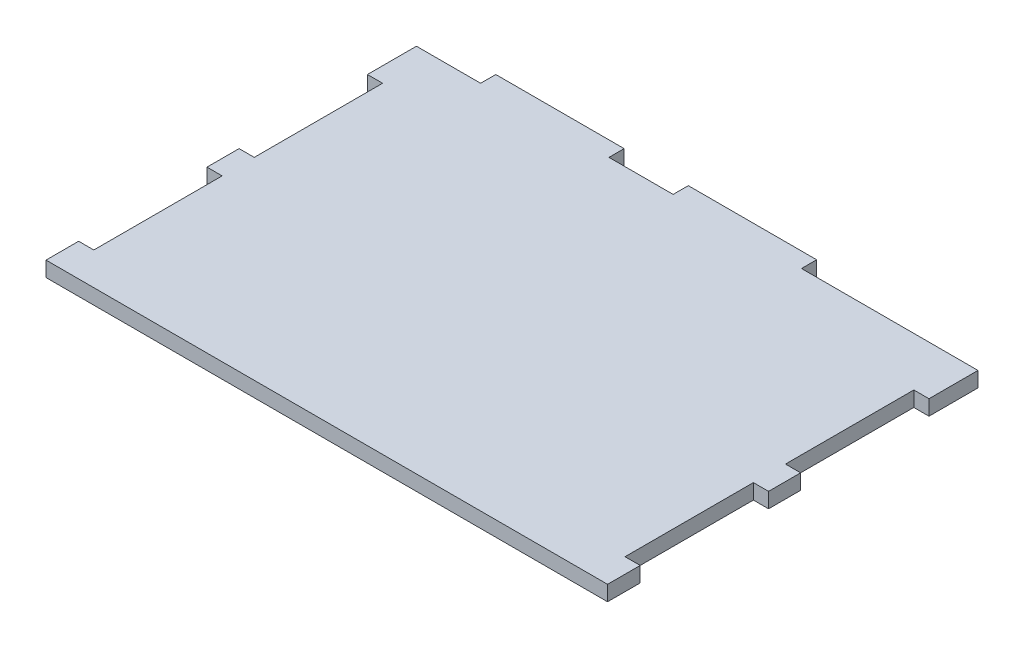
ISO-10303-21;
HEADER;
FILE_DESCRIPTION(('STEP AP214'),'2;1');
FILE_NAME('part.step','',(''),(''),'','','');
FILE_SCHEMA(('AUTOMOTIVE_DESIGN { 1 0 10303 214 1 1 1 1 }'));
ENDSEC;
DATA;
#1=APPLICATION_CONTEXT('core data for automotive mechanical design processes');
#2=APPLICATION_PROTOCOL_DEFINITION('international standard','automotive_design',2000,#1);
#3=PRODUCT_CONTEXT('',#1,'mechanical');
#4=PRODUCT('Part','Part','',(#3));
#5=PRODUCT_RELATED_PRODUCT_CATEGORY('part','',(#4));
#6=PRODUCT_DEFINITION_FORMATION('','',#4);
#7=PRODUCT_DEFINITION_CONTEXT('part definition',#1,'design');
#8=PRODUCT_DEFINITION('design','',#6,#7);
#9=PRODUCT_DEFINITION_SHAPE('','',#8);
#10=(LENGTH_UNIT() NAMED_UNIT(*) SI_UNIT(.MILLI.,.METRE.));
#11=(NAMED_UNIT(*) PLANE_ANGLE_UNIT() SI_UNIT($,.RADIAN.));
#12=(NAMED_UNIT(*) SI_UNIT($,.STERADIAN.) SOLID_ANGLE_UNIT());
#13=UNCERTAINTY_MEASURE_WITH_UNIT(LENGTH_MEASURE(1.E-05),#10,'distance_accuracy_value','');
#14=(GEOMETRIC_REPRESENTATION_CONTEXT(3) GLOBAL_UNCERTAINTY_ASSIGNED_CONTEXT((#13)) GLOBAL_UNIT_ASSIGNED_CONTEXT((#10,
#11,#12)) REPRESENTATION_CONTEXT('',''));
#15=CARTESIAN_POINT('',(0.,0.,0.));
#16=DIRECTION('',(0.,0.,1.));
#17=DIRECTION('',(1.,0.,0.));
#18=AXIS2_PLACEMENT_3D('',#15,#16,#17);
#19=CARTESIAN_POINT('',(55.565,3.,-26.955));
#20=DIRECTION('',(-1.,0.,0.));
#21=DIRECTION('',(0.,0.,1.));
#22=AXIS2_PLACEMENT_3D('',#19,#20,#21);
#23=PLANE('',#22);
#24=DIRECTION('',(0.,0.,-1.));
#25=VECTOR('',#24,1.);
#26=CARTESIAN_POINT('',(55.565,0.,-26.955));
#27=LINE('',#26,#25);
#28=CARTESIAN_POINT('',(55.565,0.,-26.955));
#29=VERTEX_POINT('',#28);
#30=CARTESIAN_POINT('',(55.565,0.,-36.655));
#31=VERTEX_POINT('',#30);
#32=EDGE_CURVE('E248',#29,#31,#27,.T.);
#33=ORIENTED_EDGE('',*,*,#32,.T.);
#34=DIRECTION('',(0.,-1.,0.));
#35=VECTOR('',#34,1.);
#36=CARTESIAN_POINT('',(55.565,3.,-36.655));
#37=LINE('',#36,#35);
#38=CARTESIAN_POINT('',(55.565,3.,-36.655));
#39=VERTEX_POINT('',#38);
#40=EDGE_CURVE('E11',#39,#31,#37,.T.);
#41=ORIENTED_EDGE('',*,*,#40,.F.);
#42=DIRECTION('',(0.,0.,-1.));
#43=VECTOR('',#42,1.);
#44=CARTESIAN_POINT('',(55.565,3.,-26.955));
#45=LINE('',#44,#43);
#46=CARTESIAN_POINT('',(55.565,3.,-26.955));
#47=VERTEX_POINT('',#46);
#48=EDGE_CURVE('E302',#47,#39,#45,.T.);
#49=ORIENTED_EDGE('',*,*,#48,.F.);
#50=DIRECTION('',(0.,-1.,0.));
#51=VECTOR('',#50,1.);
#52=CARTESIAN_POINT('',(55.565,3.,-26.955));
#53=LINE('',#52,#51);
#54=EDGE_CURVE('E244',#47,#29,#53,.T.);
#55=ORIENTED_EDGE('',*,*,#54,.T.);
#56=EDGE_LOOP('',(#33,#41,#49,#55));
#57=FACE_BOUND('',#56,.T.);
#58=ADVANCED_FACE('F32',(#57),#23,.F.);
#59=CARTESIAN_POINT('',(20.635,3.,-36.655));
#60=DIRECTION('',(0.,0.,1.));
#61=DIRECTION('',(1.,0.,0.));
#62=AXIS2_PLACEMENT_3D('',#59,#60,#61);
#63=PLANE('',#62);
#64=DIRECTION('',(-1.,0.,0.));
#65=VECTOR('',#64,1.);
#66=CARTESIAN_POINT('',(20.635,0.,-36.655));
#67=LINE('',#66,#65);
#68=CARTESIAN_POINT('',(20.635,0.,-36.655));
#69=VERTEX_POINT('',#68);
#70=EDGE_CURVE('E251',#31,#69,#67,.T.);
#71=ORIENTED_EDGE('',*,*,#70,.T.);
#72=DIRECTION('',(0.,-1.,0.));
#73=VECTOR('',#72,1.);
#74=CARTESIAN_POINT('',(20.635,3.,-36.655));
#75=LINE('',#74,#73);
#76=CARTESIAN_POINT('',(20.635,3.,-36.655));
#77=VERTEX_POINT('',#76);
#78=EDGE_CURVE('E40',#77,#69,#75,.T.);
#79=ORIENTED_EDGE('',*,*,#78,.F.);
#80=DIRECTION('',(-1.,0.,0.));
#81=VECTOR('',#80,1.);
#82=CARTESIAN_POINT('',(20.635,3.,-36.655));
#83=LINE('',#82,#81);
#84=EDGE_CURVE('E151',#39,#77,#83,.T.);
#85=ORIENTED_EDGE('',*,*,#84,.F.);
#86=ORIENTED_EDGE('',*,*,#40,.T.);
#87=EDGE_LOOP('',(#71,#79,#85,#86));
#88=FACE_BOUND('',#87,.T.);
#89=ADVANCED_FACE('F460',(#88),#63,.F.);
#90=CARTESIAN_POINT('',(20.635,3.,-36.655));
#91=DIRECTION('',(-1.,0.,0.));
#92=DIRECTION('',(0.,0.,1.));
#93=AXIS2_PLACEMENT_3D('',#90,#91,#92);
#94=PLANE('',#93);
#95=DIRECTION('',(0.,0.,-1.));
#96=VECTOR('',#95,1.);
#97=CARTESIAN_POINT('',(20.635,0.,-36.655));
#98=LINE('',#97,#96);
#99=CARTESIAN_POINT('',(20.635,0.,-39.655));
#100=VERTEX_POINT('',#99);
#101=EDGE_CURVE('E253',#69,#100,#98,.T.);
#102=ORIENTED_EDGE('',*,*,#101,.T.);
#103=DIRECTION('',(0.,-1.,0.));
#104=VECTOR('',#103,1.);
#105=CARTESIAN_POINT('',(20.635,3.,-39.655));
#106=LINE('',#105,#104);
#107=CARTESIAN_POINT('',(20.635,3.,-39.655));
#108=VERTEX_POINT('',#107);
#109=EDGE_CURVE('E369',#108,#100,#106,.T.);
#110=ORIENTED_EDGE('',*,*,#109,.F.);
#111=DIRECTION('',(0.,0.,-1.));
#112=VECTOR('',#111,1.);
#113=CARTESIAN_POINT('',(20.635,3.,-36.655));
#114=LINE('',#113,#112);
#115=EDGE_CURVE('E377',#77,#108,#114,.T.);
#116=ORIENTED_EDGE('',*,*,#115,.F.);
#117=ORIENTED_EDGE('',*,*,#78,.T.);
#118=EDGE_LOOP('',(#102,#110,#116,#117));
#119=FACE_BOUND('',#118,.T.);
#120=ADVANCED_FACE('F375',(#119),#94,.F.);
#121=CARTESIAN_POINT('',(20.635,3.,-39.655));
#122=DIRECTION('',(0.,0.,1.));
#123=DIRECTION('',(1.,0.,0.));
#124=AXIS2_PLACEMENT_3D('',#121,#122,#123);
#125=PLANE('',#124);
#126=DIRECTION('',(-1.,0.,0.));
#127=VECTOR('',#126,1.);
#128=CARTESIAN_POINT('',(20.635,0.,-39.655));
#129=LINE('',#128,#127);
#130=CARTESIAN_POINT('',(-4.765,0.,-39.655));
#131=VERTEX_POINT('',#130);
#132=EDGE_CURVE('E255',#100,#131,#129,.T.);
#133=ORIENTED_EDGE('',*,*,#132,.T.);
#134=DIRECTION('',(0.,-1.,0.));
#135=VECTOR('',#134,1.);
#136=CARTESIAN_POINT('',(-4.765,3.,-39.655));
#137=LINE('',#136,#135);
#138=CARTESIAN_POINT('',(-4.765,3.,-39.655));
#139=VERTEX_POINT('',#138);
#140=EDGE_CURVE('E366',#139,#131,#137,.T.);
#141=ORIENTED_EDGE('',*,*,#140,.F.);
#142=DIRECTION('',(-1.,0.,0.));
#143=VECTOR('',#142,1.);
#144=CARTESIAN_POINT('',(20.635,3.,-39.655));
#145=LINE('',#144,#143);
#146=EDGE_CURVE('E395',#108,#139,#145,.T.);
#147=ORIENTED_EDGE('',*,*,#146,.F.);
#148=ORIENTED_EDGE('',*,*,#109,.T.);
#149=EDGE_LOOP('',(#133,#141,#147,#148));
#150=FACE_BOUND('',#149,.T.);
#151=ADVANCED_FACE('F386',(#150),#125,.F.);
#152=CARTESIAN_POINT('',(-4.765,3.,-39.655));
#153=DIRECTION('',(1.,0.,0.));
#154=DIRECTION('',(0.,0.,-1.));
#155=AXIS2_PLACEMENT_3D('',#152,#153,#154);
#156=PLANE('',#155);
#157=DIRECTION('',(0.,0.,1.));
#158=VECTOR('',#157,1.);
#159=CARTESIAN_POINT('',(-4.765,0.,-39.655));
#160=LINE('',#159,#158);
#161=CARTESIAN_POINT('',(-4.765,0.,-36.655));
#162=VERTEX_POINT('',#161);
#163=EDGE_CURVE('E257',#131,#162,#160,.T.);
#164=ORIENTED_EDGE('',*,*,#163,.T.);
#165=DIRECTION('',(0.,-1.,0.));
#166=VECTOR('',#165,1.);
#167=CARTESIAN_POINT('',(-4.765,3.,-36.655));
#168=LINE('',#167,#166);
#169=CARTESIAN_POINT('',(-4.765,3.,-36.655));
#170=VERTEX_POINT('',#169);
#171=EDGE_CURVE('E363',#170,#162,#168,.T.);
#172=ORIENTED_EDGE('',*,*,#171,.F.);
#173=DIRECTION('',(0.,0.,1.));
#174=VECTOR('',#173,1.);
#175=CARTESIAN_POINT('',(-4.765,3.,-39.655));
#176=LINE('',#175,#174);
#177=EDGE_CURVE('E392',#139,#170,#176,.T.);
#178=ORIENTED_EDGE('',*,*,#177,.F.);
#179=ORIENTED_EDGE('',*,*,#140,.T.);
#180=EDGE_LOOP('',(#164,#172,#178,#179));
#181=FACE_BOUND('',#180,.T.);
#182=ADVANCED_FACE('F390',(#181),#156,.F.);
#183=CARTESIAN_POINT('',(-17.465,3.,-36.655));
#184=DIRECTION('',(0.,0.,1.));
#185=DIRECTION('',(1.,0.,0.));
#186=AXIS2_PLACEMENT_3D('',#183,#184,#185);
#187=PLANE('',#186);
#188=DIRECTION('',(-1.,0.,0.));
#189=VECTOR('',#188,1.);
#190=CARTESIAN_POINT('',(-17.465,0.,-36.655));
#191=LINE('',#190,#189);
#192=CARTESIAN_POINT('',(-17.465,0.,-36.655));
#193=VERTEX_POINT('',#192);
#194=EDGE_CURVE('E259',#162,#193,#191,.T.);
#195=ORIENTED_EDGE('',*,*,#194,.T.);
#196=DIRECTION('',(0.,-1.,0.));
#197=VECTOR('',#196,1.);
#198=CARTESIAN_POINT('',(-17.465,3.,-36.655));
#199=LINE('',#198,#197);
#200=CARTESIAN_POINT('',(-17.465,3.,-36.655));
#201=VERTEX_POINT('',#200);
#202=EDGE_CURVE('E360',#201,#193,#199,.T.);
#203=ORIENTED_EDGE('',*,*,#202,.F.);
#204=DIRECTION('',(-1.,0.,0.));
#205=VECTOR('',#204,1.);
#206=CARTESIAN_POINT('',(-17.465,3.,-36.655));
#207=LINE('',#206,#205);
#208=EDGE_CURVE('E394',#170,#201,#207,.T.);
#209=ORIENTED_EDGE('',*,*,#208,.F.);
#210=ORIENTED_EDGE('',*,*,#171,.T.);
#211=EDGE_LOOP('',(#195,#203,#209,#210));
#212=FACE_BOUND('',#211,.T.);
#213=ADVANCED_FACE('F473',(#212),#187,.F.);
#214=CARTESIAN_POINT('',(-17.465,3.,-36.655));
#215=DIRECTION('',(-1.,0.,0.));
#216=DIRECTION('',(0.,0.,1.));
#217=AXIS2_PLACEMENT_3D('',#214,#215,#216);
#218=PLANE('',#217);
#219=DIRECTION('',(0.,0.,-1.));
#220=VECTOR('',#219,1.);
#221=CARTESIAN_POINT('',(-17.465,0.,-36.655));
#222=LINE('',#221,#220);
#223=CARTESIAN_POINT('',(-17.465,0.,-39.655));
#224=VERTEX_POINT('',#223);
#225=EDGE_CURVE('E261',#193,#224,#222,.T.);
#226=ORIENTED_EDGE('',*,*,#225,.T.);
#227=DIRECTION('',(0.,-1.,0.));
#228=VECTOR('',#227,1.);
#229=CARTESIAN_POINT('',(-17.465,3.,-39.655));
#230=LINE('',#229,#228);
#231=CARTESIAN_POINT('',(-17.465,3.,-39.655));
#232=VERTEX_POINT('',#231);
#233=EDGE_CURVE('E357',#232,#224,#230,.T.);
#234=ORIENTED_EDGE('',*,*,#233,.F.);
#235=DIRECTION('',(0.,0.,-1.));
#236=VECTOR('',#235,1.);
#237=CARTESIAN_POINT('',(-17.465,3.,-36.655));
#238=LINE('',#237,#236);
#239=EDGE_CURVE('E397',#201,#232,#238,.T.);
#240=ORIENTED_EDGE('',*,*,#239,.F.);
#241=ORIENTED_EDGE('',*,*,#202,.T.);
#242=EDGE_LOOP('',(#226,#234,#240,#241));
#243=FACE_BOUND('',#242,.T.);
#244=ADVANCED_FACE('F476',(#243),#218,.F.);
#245=CARTESIAN_POINT('',(-17.465,3.,-39.655));
#246=DIRECTION('',(0.,0.,1.));
#247=DIRECTION('',(1.,0.,0.));
#248=AXIS2_PLACEMENT_3D('',#245,#246,#247);
#249=PLANE('',#248);
#250=DIRECTION('',(-1.,0.,0.));
#251=VECTOR('',#250,1.);
#252=CARTESIAN_POINT('',(-17.465,0.,-39.655));
#253=LINE('',#252,#251);
#254=CARTESIAN_POINT('',(-42.865,0.,-39.655));
#255=VERTEX_POINT('',#254);
#256=EDGE_CURVE('E263',#224,#255,#253,.T.);
#257=ORIENTED_EDGE('',*,*,#256,.T.);
#258=DIRECTION('',(0.,-1.,0.));
#259=VECTOR('',#258,1.);
#260=CARTESIAN_POINT('',(-42.865,3.,-39.655));
#261=LINE('',#260,#259);
#262=CARTESIAN_POINT('',(-42.865,3.,-39.655));
#263=VERTEX_POINT('',#262);
#264=EDGE_CURVE('E354',#263,#255,#261,.T.);
#265=ORIENTED_EDGE('',*,*,#264,.F.);
#266=DIRECTION('',(-1.,0.,0.));
#267=VECTOR('',#266,1.);
#268=CARTESIAN_POINT('',(-17.465,3.,-39.655));
#269=LINE('',#268,#267);
#270=EDGE_CURVE('E403',#232,#263,#269,.T.);
#271=ORIENTED_EDGE('',*,*,#270,.F.);
#272=ORIENTED_EDGE('',*,*,#233,.T.);
#273=EDGE_LOOP('',(#257,#265,#271,#272));
#274=FACE_BOUND('',#273,.T.);
#275=ADVANCED_FACE('F480',(#274),#249,.F.);
#276=CARTESIAN_POINT('',(-42.865,3.,-39.655));
#277=DIRECTION('',(1.,0.,0.));
#278=DIRECTION('',(0.,0.,-1.));
#279=AXIS2_PLACEMENT_3D('',#276,#277,#278);
#280=PLANE('',#279);
#281=DIRECTION('',(0.,0.,1.));
#282=VECTOR('',#281,1.);
#283=CARTESIAN_POINT('',(-42.865,0.,-39.655));
#284=LINE('',#283,#282);
#285=CARTESIAN_POINT('',(-42.865,0.,-36.655));
#286=VERTEX_POINT('',#285);
#287=EDGE_CURVE('E265',#255,#286,#284,.T.);
#288=ORIENTED_EDGE('',*,*,#287,.T.);
#289=DIRECTION('',(0.,-1.,0.));
#290=VECTOR('',#289,1.);
#291=CARTESIAN_POINT('',(-42.865,3.,-36.655));
#292=LINE('',#291,#290);
#293=CARTESIAN_POINT('',(-42.865,3.,-36.655));
#294=VERTEX_POINT('',#293);
#295=EDGE_CURVE('E351',#294,#286,#292,.T.);
#296=ORIENTED_EDGE('',*,*,#295,.F.);
#297=DIRECTION('',(0.,0.,1.));
#298=VECTOR('',#297,1.);
#299=CARTESIAN_POINT('',(-42.865,3.,-39.655));
#300=LINE('',#299,#298);
#301=EDGE_CURVE('E405',#263,#294,#300,.T.);
#302=ORIENTED_EDGE('',*,*,#301,.F.);
#303=ORIENTED_EDGE('',*,*,#264,.T.);
#304=EDGE_LOOP('',(#288,#296,#302,#303));
#305=FACE_BOUND('',#304,.T.);
#306=ADVANCED_FACE('F484',(#305),#280,.F.);
#307=CARTESIAN_POINT('',(-55.565,3.,-36.655));
#308=DIRECTION('',(0.,0.,1.));
#309=DIRECTION('',(1.,0.,0.));
#310=AXIS2_PLACEMENT_3D('',#307,#308,#309);
#311=PLANE('',#310);
#312=DIRECTION('',(-1.,0.,0.));
#313=VECTOR('',#312,1.);
#314=CARTESIAN_POINT('',(-55.565,0.,-36.655));
#315=LINE('',#314,#313);
#316=CARTESIAN_POINT('',(-55.565,0.,-36.655));
#317=VERTEX_POINT('',#316);
#318=EDGE_CURVE('E267',#286,#317,#315,.T.);
#319=ORIENTED_EDGE('',*,*,#318,.T.);
#320=DIRECTION('',(0.,-1.,0.));
#321=VECTOR('',#320,1.);
#322=CARTESIAN_POINT('',(-55.565,3.,-36.655));
#323=LINE('',#322,#321);
#324=CARTESIAN_POINT('',(-55.565,3.,-36.655));
#325=VERTEX_POINT('',#324);
#326=EDGE_CURVE('E348',#325,#317,#323,.T.);
#327=ORIENTED_EDGE('',*,*,#326,.F.);
#328=DIRECTION('',(-1.,0.,0.));
#329=VECTOR('',#328,1.);
#330=CARTESIAN_POINT('',(-55.565,3.,-36.655));
#331=LINE('',#330,#329);
#332=EDGE_CURVE('E407',#294,#325,#331,.T.);
#333=ORIENTED_EDGE('',*,*,#332,.F.);
#334=ORIENTED_EDGE('',*,*,#295,.T.);
#335=EDGE_LOOP('',(#319,#327,#333,#334));
#336=FACE_BOUND('',#335,.T.);
#337=ADVANCED_FACE('F488',(#336),#311,.F.);
#338=CARTESIAN_POINT('',(-55.565,3.,-26.955));
#339=DIRECTION('',(1.,0.,0.));
#340=DIRECTION('',(0.,0.,-1.));
#341=AXIS2_PLACEMENT_3D('',#338,#339,#340);
#342=PLANE('',#341);
#343=DIRECTION('',(0.,0.,1.));
#344=VECTOR('',#343,1.);
#345=CARTESIAN_POINT('',(-55.565,0.,-26.955));
#346=LINE('',#345,#344);
#347=CARTESIAN_POINT('',(-55.565,0.,-26.955));
#348=VERTEX_POINT('',#347);
#349=EDGE_CURVE('E269',#317,#348,#346,.T.);
#350=ORIENTED_EDGE('',*,*,#349,.T.);
#351=DIRECTION('',(0.,-1.,0.));
#352=VECTOR('',#351,1.);
#353=CARTESIAN_POINT('',(-55.565,3.,-26.955));
#354=LINE('',#353,#352);
#355=CARTESIAN_POINT('',(-55.565,3.,-26.955));
#356=VERTEX_POINT('',#355);
#357=EDGE_CURVE('E345',#356,#348,#354,.T.);
#358=ORIENTED_EDGE('',*,*,#357,.F.);
#359=DIRECTION('',(0.,0.,1.));
#360=VECTOR('',#359,1.);
#361=CARTESIAN_POINT('',(-55.565,3.,-26.955));
#362=LINE('',#361,#360);
#363=EDGE_CURVE('E409',#325,#356,#362,.T.);
#364=ORIENTED_EDGE('',*,*,#363,.F.);
#365=ORIENTED_EDGE('',*,*,#326,.T.);
#366=EDGE_LOOP('',(#350,#358,#364,#365));
#367=FACE_BOUND('',#366,.T.);
#368=ADVANCED_FACE('F492',(#367),#342,.F.);
#369=CARTESIAN_POINT('',(-55.565,3.,-26.955));
#370=DIRECTION('',(0.,0.,-1.));
#371=DIRECTION('',(-1.,0.,0.));
#372=AXIS2_PLACEMENT_3D('',#369,#370,#371);
#373=PLANE('',#372);
#374=DIRECTION('',(1.,0.,0.));
#375=VECTOR('',#374,1.);
#376=CARTESIAN_POINT('',(-55.565,0.,-26.955));
#377=LINE('',#376,#375);
#378=CARTESIAN_POINT('',(-52.565,0.,-26.955));
#379=VERTEX_POINT('',#378);
#380=EDGE_CURVE('E271',#348,#379,#377,.T.);
#381=ORIENTED_EDGE('',*,*,#380,.T.);
#382=DIRECTION('',(0.,-1.,0.));
#383=VECTOR('',#382,1.);
#384=CARTESIAN_POINT('',(-52.565,3.,-26.955));
#385=LINE('',#384,#383);
#386=CARTESIAN_POINT('',(-52.565,3.,-26.955));
#387=VERTEX_POINT('',#386);
#388=EDGE_CURVE('E342',#387,#379,#385,.T.);
#389=ORIENTED_EDGE('',*,*,#388,.F.);
#390=DIRECTION('',(1.,0.,0.));
#391=VECTOR('',#390,1.);
#392=CARTESIAN_POINT('',(-55.565,3.,-26.955));
#393=LINE('',#392,#391);
#394=EDGE_CURVE('E411',#356,#387,#393,.T.);
#395=ORIENTED_EDGE('',*,*,#394,.F.);
#396=ORIENTED_EDGE('',*,*,#357,.T.);
#397=EDGE_LOOP('',(#381,#389,#395,#396));
#398=FACE_BOUND('',#397,.T.);
#399=ADVANCED_FACE('F496',(#398),#373,.F.);
#400=CARTESIAN_POINT('',(-52.565,3.,-26.955));
#401=DIRECTION('',(1.,0.,0.));
#402=DIRECTION('',(0.,0.,-1.));
#403=AXIS2_PLACEMENT_3D('',#400,#401,#402);
#404=PLANE('',#403);
#405=DIRECTION('',(0.,0.,1.));
#406=VECTOR('',#405,1.);
#407=CARTESIAN_POINT('',(-52.565,0.,-26.955));
#408=LINE('',#407,#406);
#409=CARTESIAN_POINT('',(-52.565,0.,-1.55500000000002));
#410=VERTEX_POINT('',#409);
#411=EDGE_CURVE('E273',#379,#410,#408,.T.);
#412=ORIENTED_EDGE('',*,*,#411,.T.);
#413=DIRECTION('',(0.,-1.,0.));
#414=VECTOR('',#413,1.);
#415=CARTESIAN_POINT('',(-52.565,3.,-1.55500000000002));
#416=LINE('',#415,#414);
#417=CARTESIAN_POINT('',(-52.565,3.,-1.55500000000002));
#418=VERTEX_POINT('',#417);
#419=EDGE_CURVE('E339',#418,#410,#416,.T.);
#420=ORIENTED_EDGE('',*,*,#419,.F.);
#421=DIRECTION('',(0.,0.,1.));
#422=VECTOR('',#421,1.);
#423=CARTESIAN_POINT('',(-52.565,3.,-26.955));
#424=LINE('',#423,#422);
#425=EDGE_CURVE('E413',#387,#418,#424,.T.);
#426=ORIENTED_EDGE('',*,*,#425,.F.);
#427=ORIENTED_EDGE('',*,*,#388,.T.);
#428=EDGE_LOOP('',(#412,#420,#426,#427));
#429=FACE_BOUND('',#428,.T.);
#430=ADVANCED_FACE('F500',(#429),#404,.F.);
#431=CARTESIAN_POINT('',(-52.565,3.,-1.55500000000002));
#432=DIRECTION('',(0.,0.,1.));
#433=DIRECTION('',(1.,0.,0.));
#434=AXIS2_PLACEMENT_3D('',#431,#432,#433);
#435=PLANE('',#434);
#436=DIRECTION('',(-1.,0.,0.));
#437=VECTOR('',#436,1.);
#438=CARTESIAN_POINT('',(-52.565,0.,-1.55500000000002));
#439=LINE('',#438,#437);
#440=CARTESIAN_POINT('',(-55.565,0.,-1.55500000000002));
#441=VERTEX_POINT('',#440);
#442=EDGE_CURVE('E275',#410,#441,#439,.T.);
#443=ORIENTED_EDGE('',*,*,#442,.T.);
#444=DIRECTION('',(0.,-1.,0.));
#445=VECTOR('',#444,1.);
#446=CARTESIAN_POINT('',(-55.565,3.,-1.55500000000002));
#447=LINE('',#446,#445);
#448=CARTESIAN_POINT('',(-55.565,3.,-1.55500000000002));
#449=VERTEX_POINT('',#448);
#450=EDGE_CURVE('E336',#449,#441,#447,.T.);
#451=ORIENTED_EDGE('',*,*,#450,.F.);
#452=DIRECTION('',(-1.,0.,0.));
#453=VECTOR('',#452,1.);
#454=CARTESIAN_POINT('',(-52.565,3.,-1.55500000000002));
#455=LINE('',#454,#453);
#456=EDGE_CURVE('E415',#418,#449,#455,.T.);
#457=ORIENTED_EDGE('',*,*,#456,.F.);
#458=ORIENTED_EDGE('',*,*,#419,.T.);
#459=EDGE_LOOP('',(#443,#451,#457,#458));
#460=FACE_BOUND('',#459,.T.);
#461=ADVANCED_FACE('F504',(#460),#435,.F.);
#462=CARTESIAN_POINT('',(-55.565,3.,4.79499999999998));
#463=DIRECTION('',(1.,0.,0.));
#464=DIRECTION('',(0.,0.,-1.));
#465=AXIS2_PLACEMENT_3D('',#462,#463,#464);
#466=PLANE('',#465);
#467=DIRECTION('',(0.,0.,1.));
#468=VECTOR('',#467,1.);
#469=CARTESIAN_POINT('',(-55.565,0.,4.79499999999998));
#470=LINE('',#469,#468);
#471=CARTESIAN_POINT('',(-55.565,0.,4.79499999999998));
#472=VERTEX_POINT('',#471);
#473=EDGE_CURVE('E277',#441,#472,#470,.T.);
#474=ORIENTED_EDGE('',*,*,#473,.T.);
#475=DIRECTION('',(0.,-1.,0.));
#476=VECTOR('',#475,1.);
#477=CARTESIAN_POINT('',(-55.565,3.,4.79499999999998));
#478=LINE('',#477,#476);
#479=CARTESIAN_POINT('',(-55.565,3.,4.79499999999998));
#480=VERTEX_POINT('',#479);
#481=EDGE_CURVE('E333',#480,#472,#478,.T.);
#482=ORIENTED_EDGE('',*,*,#481,.F.);
#483=DIRECTION('',(0.,0.,1.));
#484=VECTOR('',#483,1.);
#485=CARTESIAN_POINT('',(-55.565,3.,4.79499999999998));
#486=LINE('',#485,#484);
#487=EDGE_CURVE('E417',#449,#480,#486,.T.);
#488=ORIENTED_EDGE('',*,*,#487,.F.);
#489=ORIENTED_EDGE('',*,*,#450,.T.);
#490=EDGE_LOOP('',(#474,#482,#488,#489));
#491=FACE_BOUND('',#490,.T.);
#492=ADVANCED_FACE('F508',(#491),#466,.F.);
#493=CARTESIAN_POINT('',(-55.565,3.,4.79499999999998));
#494=DIRECTION('',(0.,0.,-1.));
#495=DIRECTION('',(-1.,0.,0.));
#496=AXIS2_PLACEMENT_3D('',#493,#494,#495);
#497=PLANE('',#496);
#498=DIRECTION('',(1.,0.,0.));
#499=VECTOR('',#498,1.);
#500=CARTESIAN_POINT('',(-55.565,0.,4.79499999999998));
#501=LINE('',#500,#499);
#502=CARTESIAN_POINT('',(-52.565,0.,4.79499999999998));
#503=VERTEX_POINT('',#502);
#504=EDGE_CURVE('E279',#472,#503,#501,.T.);
#505=ORIENTED_EDGE('',*,*,#504,.T.);
#506=DIRECTION('',(0.,-1.,0.));
#507=VECTOR('',#506,1.);
#508=CARTESIAN_POINT('',(-52.565,3.,4.79499999999998));
#509=LINE('',#508,#507);
#510=CARTESIAN_POINT('',(-52.565,3.,4.79499999999998));
#511=VERTEX_POINT('',#510);
#512=EDGE_CURVE('E330',#511,#503,#509,.T.);
#513=ORIENTED_EDGE('',*,*,#512,.F.);
#514=DIRECTION('',(1.,0.,0.));
#515=VECTOR('',#514,1.);
#516=CARTESIAN_POINT('',(-55.565,3.,4.79499999999998));
#517=LINE('',#516,#515);
#518=EDGE_CURVE('E419',#480,#511,#517,.T.);
#519=ORIENTED_EDGE('',*,*,#518,.F.);
#520=ORIENTED_EDGE('',*,*,#481,.T.);
#521=EDGE_LOOP('',(#505,#513,#519,#520));
#522=FACE_BOUND('',#521,.T.);
#523=ADVANCED_FACE('F512',(#522),#497,.F.);
#524=CARTESIAN_POINT('',(-52.565,3.,4.79499999999998));
#525=DIRECTION('',(1.,0.,0.));
#526=DIRECTION('',(0.,0.,-1.));
#527=AXIS2_PLACEMENT_3D('',#524,#525,#526);
#528=PLANE('',#527);
#529=DIRECTION('',(0.,0.,1.));
#530=VECTOR('',#529,1.);
#531=CARTESIAN_POINT('',(-52.565,0.,4.79499999999998));
#532=LINE('',#531,#530);
#533=CARTESIAN_POINT('',(-52.565,0.,30.195));
#534=VERTEX_POINT('',#533);
#535=EDGE_CURVE('E281',#503,#534,#532,.T.);
#536=ORIENTED_EDGE('',*,*,#535,.T.);
#537=DIRECTION('',(0.,-1.,0.));
#538=VECTOR('',#537,1.);
#539=CARTESIAN_POINT('',(-52.565,3.,30.195));
#540=LINE('',#539,#538);
#541=CARTESIAN_POINT('',(-52.565,3.,30.195));
#542=VERTEX_POINT('',#541);
#543=EDGE_CURVE('E327',#542,#534,#540,.T.);
#544=ORIENTED_EDGE('',*,*,#543,.F.);
#545=DIRECTION('',(0.,0.,1.));
#546=VECTOR('',#545,1.);
#547=CARTESIAN_POINT('',(-52.565,3.,4.79499999999998));
#548=LINE('',#547,#546);
#549=EDGE_CURVE('E421',#511,#542,#548,.T.);
#550=ORIENTED_EDGE('',*,*,#549,.F.);
#551=ORIENTED_EDGE('',*,*,#512,.T.);
#552=EDGE_LOOP('',(#536,#544,#550,#551));
#553=FACE_BOUND('',#552,.T.);
#554=ADVANCED_FACE('F516',(#553),#528,.F.);
#555=CARTESIAN_POINT('',(-52.565,3.,30.195));
#556=DIRECTION('',(0.,0.,1.));
#557=DIRECTION('',(1.,0.,0.));
#558=AXIS2_PLACEMENT_3D('',#555,#556,#557);
#559=PLANE('',#558);
#560=DIRECTION('',(-1.,0.,0.));
#561=VECTOR('',#560,1.);
#562=CARTESIAN_POINT('',(-52.565,0.,30.195));
#563=LINE('',#562,#561);
#564=CARTESIAN_POINT('',(-55.565,0.,30.195));
#565=VERTEX_POINT('',#564);
#566=EDGE_CURVE('E283',#534,#565,#563,.T.);
#567=ORIENTED_EDGE('',*,*,#566,.T.);
#568=DIRECTION('',(0.,-1.,0.));
#569=VECTOR('',#568,1.);
#570=CARTESIAN_POINT('',(-55.565,3.,30.195));
#571=LINE('',#570,#569);
#572=CARTESIAN_POINT('',(-55.565,3.,30.195));
#573=VERTEX_POINT('',#572);
#574=EDGE_CURVE('E324',#573,#565,#571,.T.);
#575=ORIENTED_EDGE('',*,*,#574,.F.);
#576=DIRECTION('',(-1.,0.,0.));
#577=VECTOR('',#576,1.);
#578=CARTESIAN_POINT('',(-52.565,3.,30.195));
#579=LINE('',#578,#577);
#580=EDGE_CURVE('E423',#542,#573,#579,.T.);
#581=ORIENTED_EDGE('',*,*,#580,.F.);
#582=ORIENTED_EDGE('',*,*,#543,.T.);
#583=EDGE_LOOP('',(#567,#575,#581,#582));
#584=FACE_BOUND('',#583,.T.);
#585=ADVANCED_FACE('F520',(#584),#559,.F.);
#586=CARTESIAN_POINT('',(-55.565,3.,36.655));
#587=DIRECTION('',(1.,0.,0.));
#588=DIRECTION('',(0.,0.,-1.));
#589=AXIS2_PLACEMENT_3D('',#586,#587,#588);
#590=PLANE('',#589);
#591=DIRECTION('',(0.,0.,1.));
#592=VECTOR('',#591,1.);
#593=CARTESIAN_POINT('',(-55.565,0.,36.655));
#594=LINE('',#593,#592);
#595=CARTESIAN_POINT('',(-55.565,0.,36.655));
#596=VERTEX_POINT('',#595);
#597=EDGE_CURVE('E285',#565,#596,#594,.T.);
#598=ORIENTED_EDGE('',*,*,#597,.T.);
#599=DIRECTION('',(0.,-1.,0.));
#600=VECTOR('',#599,1.);
#601=CARTESIAN_POINT('',(-55.565,3.,36.655));
#602=LINE('',#601,#600);
#603=CARTESIAN_POINT('',(-55.565,3.,36.655));
#604=VERTEX_POINT('',#603);
#605=EDGE_CURVE('E321',#604,#596,#602,.T.);
#606=ORIENTED_EDGE('',*,*,#605,.F.);
#607=DIRECTION('',(0.,0.,1.));
#608=VECTOR('',#607,1.);
#609=CARTESIAN_POINT('',(-55.565,3.,36.655));
#610=LINE('',#609,#608);
#611=EDGE_CURVE('E425',#573,#604,#610,.T.);
#612=ORIENTED_EDGE('',*,*,#611,.F.);
#613=ORIENTED_EDGE('',*,*,#574,.T.);
#614=EDGE_LOOP('',(#598,#606,#612,#613));
#615=FACE_BOUND('',#614,.T.);
#616=ADVANCED_FACE('F524',(#615),#590,.F.);
#617=CARTESIAN_POINT('',(-55.565,3.,36.655));
#618=DIRECTION('',(0.,0.,-1.));
#619=DIRECTION('',(-1.,0.,0.));
#620=AXIS2_PLACEMENT_3D('',#617,#618,#619);
#621=PLANE('',#620);
#622=DIRECTION('',(1.,0.,0.));
#623=VECTOR('',#622,1.);
#624=CARTESIAN_POINT('',(-55.565,0.,36.655));
#625=LINE('',#624,#623);
#626=CARTESIAN_POINT('',(55.565,0.,36.655));
#627=VERTEX_POINT('',#626);
#628=EDGE_CURVE('E287',#596,#627,#625,.T.);
#629=ORIENTED_EDGE('',*,*,#628,.T.);
#630=DIRECTION('',(0.,-1.,0.));
#631=VECTOR('',#630,1.);
#632=CARTESIAN_POINT('',(55.565,3.,36.655));
#633=LINE('',#632,#631);
#634=CARTESIAN_POINT('',(55.565,3.,36.655));
#635=VERTEX_POINT('',#634);
#636=EDGE_CURVE('E318',#635,#627,#633,.T.);
#637=ORIENTED_EDGE('',*,*,#636,.F.);
#638=DIRECTION('',(1.,0.,0.));
#639=VECTOR('',#638,1.);
#640=CARTESIAN_POINT('',(-55.565,3.,36.655));
#641=LINE('',#640,#639);
#642=EDGE_CURVE('E427',#604,#635,#641,.T.);
#643=ORIENTED_EDGE('',*,*,#642,.F.);
#644=ORIENTED_EDGE('',*,*,#605,.T.);
#645=EDGE_LOOP('',(#629,#637,#643,#644));
#646=FACE_BOUND('',#645,.T.);
#647=ADVANCED_FACE('F528',(#646),#621,.F.);
#648=CARTESIAN_POINT('',(55.565,3.,36.655));
#649=DIRECTION('',(-1.,0.,0.));
#650=DIRECTION('',(0.,0.,1.));
#651=AXIS2_PLACEMENT_3D('',#648,#649,#650);
#652=PLANE('',#651);
#653=DIRECTION('',(0.,0.,-1.));
#654=VECTOR('',#653,1.);
#655=CARTESIAN_POINT('',(55.565,0.,36.655));
#656=LINE('',#655,#654);
#657=CARTESIAN_POINT('',(55.565,0.,30.195));
#658=VERTEX_POINT('',#657);
#659=EDGE_CURVE('E289',#627,#658,#656,.T.);
#660=ORIENTED_EDGE('',*,*,#659,.T.);
#661=DIRECTION('',(0.,-1.,0.));
#662=VECTOR('',#661,1.);
#663=CARTESIAN_POINT('',(55.565,3.,30.195));
#664=LINE('',#663,#662);
#665=CARTESIAN_POINT('',(55.565,3.,30.195));
#666=VERTEX_POINT('',#665);
#667=EDGE_CURVE('E315',#666,#658,#664,.T.);
#668=ORIENTED_EDGE('',*,*,#667,.F.);
#669=DIRECTION('',(0.,0.,-1.));
#670=VECTOR('',#669,1.);
#671=CARTESIAN_POINT('',(55.565,3.,36.655));
#672=LINE('',#671,#670);
#673=EDGE_CURVE('E429',#635,#666,#672,.T.);
#674=ORIENTED_EDGE('',*,*,#673,.F.);
#675=ORIENTED_EDGE('',*,*,#636,.T.);
#676=EDGE_LOOP('',(#660,#668,#674,#675));
#677=FACE_BOUND('',#676,.T.);
#678=ADVANCED_FACE('F532',(#677),#652,.F.);
#679=CARTESIAN_POINT('',(52.565,3.,30.195));
#680=DIRECTION('',(0.,0.,1.));
#681=DIRECTION('',(1.,0.,0.));
#682=AXIS2_PLACEMENT_3D('',#679,#680,#681);
#683=PLANE('',#682);
#684=DIRECTION('',(-1.,0.,0.));
#685=VECTOR('',#684,1.);
#686=CARTESIAN_POINT('',(52.565,0.,30.195));
#687=LINE('',#686,#685);
#688=CARTESIAN_POINT('',(52.565,0.,30.195));
#689=VERTEX_POINT('',#688);
#690=EDGE_CURVE('E291',#658,#689,#687,.T.);
#691=ORIENTED_EDGE('',*,*,#690,.T.);
#692=DIRECTION('',(0.,-1.,0.));
#693=VECTOR('',#692,1.);
#694=CARTESIAN_POINT('',(52.565,3.,30.195));
#695=LINE('',#694,#693);
#696=CARTESIAN_POINT('',(52.565,3.,30.195));
#697=VERTEX_POINT('',#696);
#698=EDGE_CURVE('E312',#697,#689,#695,.T.);
#699=ORIENTED_EDGE('',*,*,#698,.F.);
#700=DIRECTION('',(-1.,0.,0.));
#701=VECTOR('',#700,1.);
#702=CARTESIAN_POINT('',(52.565,3.,30.195));
#703=LINE('',#702,#701);
#704=EDGE_CURVE('E431',#666,#697,#703,.T.);
#705=ORIENTED_EDGE('',*,*,#704,.F.);
#706=ORIENTED_EDGE('',*,*,#667,.T.);
#707=EDGE_LOOP('',(#691,#699,#705,#706));
#708=FACE_BOUND('',#707,.T.);
#709=ADVANCED_FACE('F536',(#708),#683,.F.);
#710=CARTESIAN_POINT('',(52.565,3.,4.79499999999996));
#711=DIRECTION('',(-1.,0.,0.));
#712=DIRECTION('',(0.,0.,1.));
#713=AXIS2_PLACEMENT_3D('',#710,#711,#712);
#714=PLANE('',#713);
#715=DIRECTION('',(0.,0.,-1.));
#716=VECTOR('',#715,1.);
#717=CARTESIAN_POINT('',(52.565,0.,4.79499999999996));
#718=LINE('',#717,#716);
#719=CARTESIAN_POINT('',(52.565,0.,4.79499999999996));
#720=VERTEX_POINT('',#719);
#721=EDGE_CURVE('E293',#689,#720,#718,.T.);
#722=ORIENTED_EDGE('',*,*,#721,.T.);
#723=DIRECTION('',(0.,-1.,0.));
#724=VECTOR('',#723,1.);
#725=CARTESIAN_POINT('',(52.565,3.,4.79499999999996));
#726=LINE('',#725,#724);
#727=CARTESIAN_POINT('',(52.565,3.,4.79499999999996));
#728=VERTEX_POINT('',#727);
#729=EDGE_CURVE('E309',#728,#720,#726,.T.);
#730=ORIENTED_EDGE('',*,*,#729,.F.);
#731=DIRECTION('',(0.,0.,-1.));
#732=VECTOR('',#731,1.);
#733=CARTESIAN_POINT('',(52.565,3.,4.79499999999996));
#734=LINE('',#733,#732);
#735=EDGE_CURVE('E433',#697,#728,#734,.T.);
#736=ORIENTED_EDGE('',*,*,#735,.F.);
#737=ORIENTED_EDGE('',*,*,#698,.T.);
#738=EDGE_LOOP('',(#722,#730,#736,#737));
#739=FACE_BOUND('',#738,.T.);
#740=ADVANCED_FACE('F540',(#739),#714,.F.);
#741=CARTESIAN_POINT('',(55.565,3.,4.79499999999996));
#742=DIRECTION('',(0.,0.,-1.));
#743=DIRECTION('',(-1.,0.,0.));
#744=AXIS2_PLACEMENT_3D('',#741,#742,#743);
#745=PLANE('',#744);
#746=DIRECTION('',(1.,0.,0.));
#747=VECTOR('',#746,1.);
#748=CARTESIAN_POINT('',(55.565,0.,4.79499999999996));
#749=LINE('',#748,#747);
#750=CARTESIAN_POINT('',(55.565,0.,4.79499999999996));
#751=VERTEX_POINT('',#750);
#752=EDGE_CURVE('E295',#720,#751,#749,.T.);
#753=ORIENTED_EDGE('',*,*,#752,.T.);
#754=DIRECTION('',(0.,-1.,0.));
#755=VECTOR('',#754,1.);
#756=CARTESIAN_POINT('',(55.565,3.,4.79499999999996));
#757=LINE('',#756,#755);
#758=CARTESIAN_POINT('',(55.565,3.,4.79499999999996));
#759=VERTEX_POINT('',#758);
#760=EDGE_CURVE('E306',#759,#751,#757,.T.);
#761=ORIENTED_EDGE('',*,*,#760,.F.);
#762=DIRECTION('',(1.,0.,0.));
#763=VECTOR('',#762,1.);
#764=CARTESIAN_POINT('',(55.565,3.,4.79499999999996));
#765=LINE('',#764,#763);
#766=EDGE_CURVE('E435',#728,#759,#765,.T.);
#767=ORIENTED_EDGE('',*,*,#766,.F.);
#768=ORIENTED_EDGE('',*,*,#729,.T.);
#769=EDGE_LOOP('',(#753,#761,#767,#768));
#770=FACE_BOUND('',#769,.T.);
#771=ADVANCED_FACE('F441',(#770),#745,.F.);
#772=CARTESIAN_POINT('',(55.565,3.,4.79499999999996));
#773=DIRECTION('',(-1.,0.,0.));
#774=DIRECTION('',(0.,0.,1.));
#775=AXIS2_PLACEMENT_3D('',#772,#773,#774);
#776=PLANE('',#775);
#777=DIRECTION('',(0.,0.,-1.));
#778=VECTOR('',#777,1.);
#779=CARTESIAN_POINT('',(55.565,0.,4.79499999999996));
#780=LINE('',#779,#778);
#781=CARTESIAN_POINT('',(55.565,0.,-1.55500000000004));
#782=VERTEX_POINT('',#781);
#783=EDGE_CURVE('E297',#751,#782,#780,.T.);
#784=ORIENTED_EDGE('',*,*,#783,.T.);
#785=DIRECTION('',(0.,-1.,0.));
#786=VECTOR('',#785,1.);
#787=CARTESIAN_POINT('',(55.565,3.,-1.55500000000004));
#788=LINE('',#787,#786);
#789=CARTESIAN_POINT('',(55.565,3.,-1.55500000000004));
#790=VERTEX_POINT('',#789);
#791=EDGE_CURVE('E239',#790,#782,#788,.T.);
#792=ORIENTED_EDGE('',*,*,#791,.F.);
#793=DIRECTION('',(0.,0.,-1.));
#794=VECTOR('',#793,1.);
#795=CARTESIAN_POINT('',(55.565,3.,4.79499999999996));
#796=LINE('',#795,#794);
#797=EDGE_CURVE('E230',#759,#790,#796,.T.);
#798=ORIENTED_EDGE('',*,*,#797,.F.);
#799=ORIENTED_EDGE('',*,*,#760,.T.);
#800=EDGE_LOOP('',(#784,#792,#798,#799));
#801=FACE_BOUND('',#800,.T.);
#802=ADVANCED_FACE('F445',(#801),#776,.F.);
#803=CARTESIAN_POINT('',(52.565,3.,-1.55500000000004));
#804=DIRECTION('',(0.,0.,1.));
#805=DIRECTION('',(1.,0.,0.));
#806=AXIS2_PLACEMENT_3D('',#803,#804,#805);
#807=PLANE('',#806);
#808=DIRECTION('',(-1.,0.,0.));
#809=VECTOR('',#808,1.);
#810=CARTESIAN_POINT('',(52.565,0.,-1.55500000000004));
#811=LINE('',#810,#809);
#812=CARTESIAN_POINT('',(52.565,0.,-1.55500000000004));
#813=VERTEX_POINT('',#812);
#814=EDGE_CURVE('E238',#782,#813,#811,.T.);
#815=ORIENTED_EDGE('',*,*,#814,.T.);
#816=DIRECTION('',(0.,-1.,0.));
#817=VECTOR('',#816,1.);
#818=CARTESIAN_POINT('',(52.565,3.,-1.55500000000004));
#819=LINE('',#818,#817);
#820=CARTESIAN_POINT('',(52.565,3.,-1.55500000000004));
#821=VERTEX_POINT('',#820);
#822=EDGE_CURVE('E235',#821,#813,#819,.T.);
#823=ORIENTED_EDGE('',*,*,#822,.F.);
#824=DIRECTION('',(-1.,0.,0.));
#825=VECTOR('',#824,1.);
#826=CARTESIAN_POINT('',(52.565,3.,-1.55500000000004));
#827=LINE('',#826,#825);
#828=EDGE_CURVE('E224',#790,#821,#827,.T.);
#829=ORIENTED_EDGE('',*,*,#828,.F.);
#830=ORIENTED_EDGE('',*,*,#791,.T.);
#831=EDGE_LOOP('',(#815,#823,#829,#830));
#832=FACE_BOUND('',#831,.T.);
#833=ADVANCED_FACE('F236',(#832),#807,.F.);
#834=CARTESIAN_POINT('',(52.565,3.,-26.955));
#835=DIRECTION('',(-1.,0.,0.));
#836=DIRECTION('',(0.,0.,1.));
#837=AXIS2_PLACEMENT_3D('',#834,#835,#836);
#838=PLANE('',#837);
#839=DIRECTION('',(0.,0.,-1.));
#840=VECTOR('',#839,1.);
#841=CARTESIAN_POINT('',(52.565,0.,-26.955));
#842=LINE('',#841,#840);
#843=CARTESIAN_POINT('',(52.565,0.,-26.955));
#844=VERTEX_POINT('',#843);
#845=EDGE_CURVE('E137',#813,#844,#842,.T.);
#846=ORIENTED_EDGE('',*,*,#845,.T.);
#847=DIRECTION('',(0.,-1.,0.));
#848=VECTOR('',#847,1.);
#849=CARTESIAN_POINT('',(52.565,3.,-26.955));
#850=LINE('',#849,#848);
#851=CARTESIAN_POINT('',(52.565,3.,-26.955));
#852=VERTEX_POINT('',#851);
#853=EDGE_CURVE('E240',#852,#844,#850,.T.);
#854=ORIENTED_EDGE('',*,*,#853,.F.);
#855=DIRECTION('',(0.,0.,-1.));
#856=VECTOR('',#855,1.);
#857=CARTESIAN_POINT('',(52.565,3.,-26.955));
#858=LINE('',#857,#856);
#859=EDGE_CURVE('E228',#821,#852,#858,.T.);
#860=ORIENTED_EDGE('',*,*,#859,.F.);
#861=ORIENTED_EDGE('',*,*,#822,.T.);
#862=EDGE_LOOP('',(#846,#854,#860,#861));
#863=FACE_BOUND('',#862,.T.);
#864=ADVANCED_FACE('F242',(#863),#838,.F.);
#865=CARTESIAN_POINT('',(55.565,3.,-26.955));
#866=DIRECTION('',(0.,0.,-1.));
#867=DIRECTION('',(-1.,0.,0.));
#868=AXIS2_PLACEMENT_3D('',#865,#866,#867);
#869=PLANE('',#868);
#870=DIRECTION('',(1.,0.,0.));
#871=VECTOR('',#870,1.);
#872=CARTESIAN_POINT('',(55.565,0.,-26.955));
#873=LINE('',#872,#871);
#874=EDGE_CURVE('E143',#844,#29,#873,.T.);
#875=ORIENTED_EDGE('',*,*,#874,.T.);
#876=ORIENTED_EDGE('',*,*,#54,.F.);
#877=DIRECTION('',(1.,0.,0.));
#878=VECTOR('',#877,1.);
#879=CARTESIAN_POINT('',(55.565,3.,-26.955));
#880=LINE('',#879,#878);
#881=EDGE_CURVE('E48',#852,#47,#880,.T.);
#882=ORIENTED_EDGE('',*,*,#881,.F.);
#883=ORIENTED_EDGE('',*,*,#853,.T.);
#884=EDGE_LOOP('',(#875,#876,#882,#883));
#885=FACE_BOUND('',#884,.T.);
#886=ADVANCED_FACE('F449',(#885),#869,.F.);
#887=CARTESIAN_POINT('',(0.,3.,0.));
#888=DIRECTION('',(0.,-1.,0.));
#889=DIRECTION('',(0.,0.,-1.));
#890=AXIS2_PLACEMENT_3D('',#887,#888,#889);
#891=PLANE('',#890);
#892=ORIENTED_EDGE('',*,*,#48,.T.);
#893=ORIENTED_EDGE('',*,*,#84,.T.);
#894=ORIENTED_EDGE('',*,*,#115,.T.);
#895=ORIENTED_EDGE('',*,*,#146,.T.);
#896=ORIENTED_EDGE('',*,*,#177,.T.);
#897=ORIENTED_EDGE('',*,*,#208,.T.);
#898=ORIENTED_EDGE('',*,*,#239,.T.);
#899=ORIENTED_EDGE('',*,*,#270,.T.);
#900=ORIENTED_EDGE('',*,*,#301,.T.);
#901=ORIENTED_EDGE('',*,*,#332,.T.);
#902=ORIENTED_EDGE('',*,*,#363,.T.);
#903=ORIENTED_EDGE('',*,*,#394,.T.);
#904=ORIENTED_EDGE('',*,*,#425,.T.);
#905=ORIENTED_EDGE('',*,*,#456,.T.);
#906=ORIENTED_EDGE('',*,*,#487,.T.);
#907=ORIENTED_EDGE('',*,*,#518,.T.);
#908=ORIENTED_EDGE('',*,*,#549,.T.);
#909=ORIENTED_EDGE('',*,*,#580,.T.);
#910=ORIENTED_EDGE('',*,*,#611,.T.);
#911=ORIENTED_EDGE('',*,*,#642,.T.);
#912=ORIENTED_EDGE('',*,*,#673,.T.);
#913=ORIENTED_EDGE('',*,*,#704,.T.);
#914=ORIENTED_EDGE('',*,*,#735,.T.);
#915=ORIENTED_EDGE('',*,*,#766,.T.);
#916=ORIENTED_EDGE('',*,*,#797,.T.);
#917=ORIENTED_EDGE('',*,*,#828,.T.);
#918=ORIENTED_EDGE('',*,*,#859,.T.);
#919=ORIENTED_EDGE('',*,*,#881,.T.);
#920=EDGE_LOOP('',(#892,#893,#894,#895,#896,#897,#898,#899,#900,#901,#902,#903,#904,#905,#906,
#907,#908,#909,#910,#911,#912,#913,#914,#915,#916,#917,#918,#919));
#921=FACE_BOUND('',#920,.T.);
#922=ADVANCED_FACE('F226',(#921),#891,.F.);
#923=CARTESIAN_POINT('',(0.,0.,0.));
#924=DIRECTION('',(0.,-1.,0.));
#925=DIRECTION('',(0.,0.,-1.));
#926=AXIS2_PLACEMENT_3D('',#923,#924,#925);
#927=PLANE('',#926);
#928=ORIENTED_EDGE('',*,*,#32,.F.);
#929=ORIENTED_EDGE('',*,*,#874,.F.);
#930=ORIENTED_EDGE('',*,*,#845,.F.);
#931=ORIENTED_EDGE('',*,*,#814,.F.);
#932=ORIENTED_EDGE('',*,*,#783,.F.);
#933=ORIENTED_EDGE('',*,*,#752,.F.);
#934=ORIENTED_EDGE('',*,*,#721,.F.);
#935=ORIENTED_EDGE('',*,*,#690,.F.);
#936=ORIENTED_EDGE('',*,*,#659,.F.);
#937=ORIENTED_EDGE('',*,*,#628,.F.);
#938=ORIENTED_EDGE('',*,*,#597,.F.);
#939=ORIENTED_EDGE('',*,*,#566,.F.);
#940=ORIENTED_EDGE('',*,*,#535,.F.);
#941=ORIENTED_EDGE('',*,*,#504,.F.);
#942=ORIENTED_EDGE('',*,*,#473,.F.);
#943=ORIENTED_EDGE('',*,*,#442,.F.);
#944=ORIENTED_EDGE('',*,*,#411,.F.);
#945=ORIENTED_EDGE('',*,*,#380,.F.);
#946=ORIENTED_EDGE('',*,*,#349,.F.);
#947=ORIENTED_EDGE('',*,*,#318,.F.);
#948=ORIENTED_EDGE('',*,*,#287,.F.);
#949=ORIENTED_EDGE('',*,*,#256,.F.);
#950=ORIENTED_EDGE('',*,*,#225,.F.);
#951=ORIENTED_EDGE('',*,*,#194,.F.);
#952=ORIENTED_EDGE('',*,*,#163,.F.);
#953=ORIENTED_EDGE('',*,*,#132,.F.);
#954=ORIENTED_EDGE('',*,*,#101,.F.);
#955=ORIENTED_EDGE('',*,*,#70,.F.);
#956=EDGE_LOOP('',(#928,#929,#930,#931,#932,#933,#934,#935,#936,#937,#938,#939,#940,#941,#942,
#943,#944,#945,#946,#947,#948,#949,#950,#951,#952,#953,#954,#955));
#957=FACE_BOUND('',#956,.T.);
#958=ADVANCED_FACE('F381',(#957),#927,.T.);
#959=CLOSED_SHELL('',(#58,#89,#120,#151,#182,#213,#244,#275,#306,#337,#368,#399,#430,#461,#492,
#523,#554,#585,#616,#647,#678,#709,#740,#771,#802,#833,#864,#886,#922,#958));
#960=MANIFOLD_SOLID_BREP('B2',#959);
#961=ADVANCED_BREP_SHAPE_REPRESENTATION('',(#18,#960),#14);
#962=SHAPE_DEFINITION_REPRESENTATION(#9,#961);
ENDSEC;
END-ISO-10303-21;
